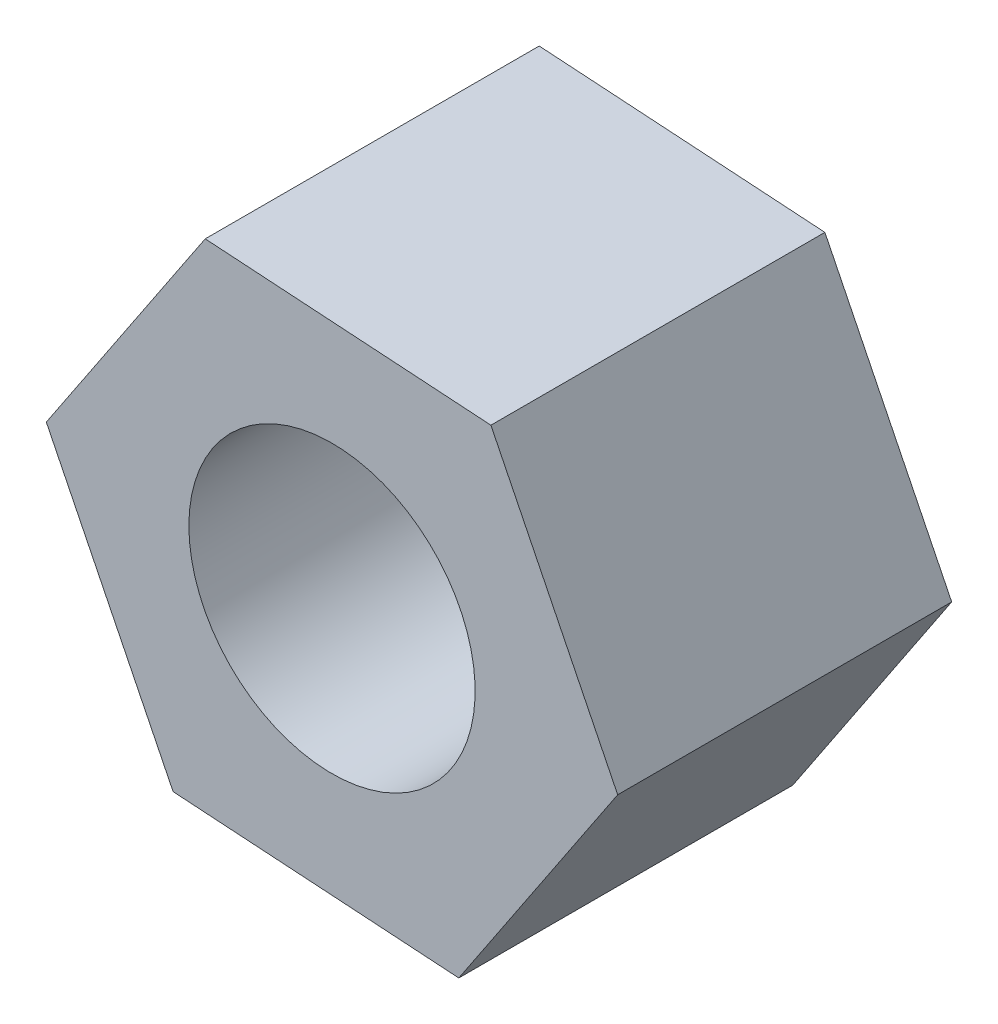
ISO-10303-21;
HEADER;
FILE_DESCRIPTION(('STEP AP214'),'2;1');
FILE_NAME('part.step','',(''),(''),'','','');
FILE_SCHEMA(('AUTOMOTIVE_DESIGN { 1 0 10303 214 1 1 1 1 }'));
ENDSEC;
DATA;
#1=APPLICATION_CONTEXT('core data for automotive mechanical design processes');
#2=APPLICATION_PROTOCOL_DEFINITION('international standard','automotive_design',2000,#1);
#3=PRODUCT_CONTEXT('',#1,'mechanical');
#4=PRODUCT('Part','Part','',(#3));
#5=PRODUCT_RELATED_PRODUCT_CATEGORY('part','',(#4));
#6=PRODUCT_DEFINITION_FORMATION('','',#4);
#7=PRODUCT_DEFINITION_CONTEXT('part definition',#1,'design');
#8=PRODUCT_DEFINITION('design','',#6,#7);
#9=PRODUCT_DEFINITION_SHAPE('','',#8);
#10=(LENGTH_UNIT() NAMED_UNIT(*) SI_UNIT(.MILLI.,.METRE.));
#11=(NAMED_UNIT(*) PLANE_ANGLE_UNIT() SI_UNIT($,.RADIAN.));
#12=(NAMED_UNIT(*) SI_UNIT($,.STERADIAN.) SOLID_ANGLE_UNIT());
#13=UNCERTAINTY_MEASURE_WITH_UNIT(LENGTH_MEASURE(1.E-05),#10,'distance_accuracy_value','');
#14=(GEOMETRIC_REPRESENTATION_CONTEXT(3) GLOBAL_UNCERTAINTY_ASSIGNED_CONTEXT((#13)) GLOBAL_UNIT_ASSIGNED_CONTEXT((#10,
#11,#12)) REPRESENTATION_CONTEXT('',''));
#15=CARTESIAN_POINT('',(0.,0.,0.));
#16=DIRECTION('',(0.,0.,1.));
#17=DIRECTION('',(1.,0.,0.));
#18=AXIS2_PLACEMENT_3D('',#15,#16,#17);
#19=CARTESIAN_POINT('',(-1.11022302462516E-13,1.66533453693773E-13,70.0000000000001));
#20=DIRECTION('',(0.,0.,0.999999999999999));
#21=DIRECTION('',(1.,0.,0.));
#22=AXIS2_PLACEMENT_3D('',#19,#20,#21);
#23=PLANE('',#22);
#24=DIRECTION('',(-0.555047324024189,-0.831818771183719,0.));
#25=VECTOR('',#24,1.);
#26=CARTESIAN_POINT('',(-26.5711515106658,53.7956681099628,69.9999999999995));
#27=LINE('',#26,#25);
#28=CARTESIAN_POINT('',(-26.5711515106658,53.7956681099628,69.9999999999995));
#29=VERTEX_POINT('',#28);
#30=CARTESIAN_POINT('',(-59.8739909521171,3.88654183893933,70.0000000000001));
#31=VERTEX_POINT('',#30);
#32=EDGE_CURVE('E152',#29,#31,#27,.T.);
#33=ORIENTED_EDGE('',*,*,#32,.T.);
#34=DIRECTION('',(0.442852525177762,-0.89659446849938,0.));
#35=VECTOR('',#34,1.);
#36=CARTESIAN_POINT('',(-59.8739909521171,3.88654183893933,70.0000000000001));
#37=LINE('',#36,#35);
#38=CARTESIAN_POINT('',(-33.3028394414516,-49.9091262710231,70.0000000000001));
#39=VERTEX_POINT('',#38);
#40=EDGE_CURVE('E99',#31,#39,#37,.T.);
#41=ORIENTED_EDGE('',*,*,#40,.T.);
#42=DIRECTION('',(0.997899849201951,-0.0647756973156602,0.));
#43=VECTOR('',#42,1.);
#44=CARTESIAN_POINT('',(-33.3028394414516,-49.9091262710231,70.0000000000001));
#45=LINE('',#44,#43);
#46=CARTESIAN_POINT('',(26.5711515106654,-53.7956681099627,70.0000000000001));
#47=VERTEX_POINT('',#46);
#48=EDGE_CURVE('E112',#39,#47,#45,.T.);
#49=ORIENTED_EDGE('',*,*,#48,.T.);
#50=DIRECTION('',(0.555047324024189,0.831818771183719,0.));
#51=VECTOR('',#50,1.);
#52=CARTESIAN_POINT('',(26.5711515106654,-53.7956681099627,70.0000000000001));
#53=LINE('',#52,#51);
#54=CARTESIAN_POINT('',(59.8739909521168,-3.88654183893977,69.9999999999995));
#55=VERTEX_POINT('',#54);
#56=EDGE_CURVE('E106',#47,#55,#53,.T.);
#57=ORIENTED_EDGE('',*,*,#56,.T.);
#58=DIRECTION('',(-0.442852525177762,0.896594468499379,0.));
#59=VECTOR('',#58,1.);
#60=CARTESIAN_POINT('',(59.8739909521168,-3.88654183893977,69.9999999999995));
#61=LINE('',#60,#59);
#62=CARTESIAN_POINT('',(33.3028394414508,49.9091262710232,70.0000000000001));
#63=VERTEX_POINT('',#62);
#64=EDGE_CURVE('E110',#55,#63,#61,.T.);
#65=ORIENTED_EDGE('',*,*,#64,.T.);
#66=DIRECTION('',(-0.997899849201951,0.0647756973156602,0.));
#67=VECTOR('',#66,1.);
#68=CARTESIAN_POINT('',(33.3028394414508,49.9091262710232,70.0000000000001));
#69=LINE('',#68,#67);
#70=EDGE_CURVE('E62',#63,#29,#69,.T.);
#71=ORIENTED_EDGE('',*,*,#70,.T.);
#72=EDGE_LOOP('',(#33,#41,#49,#57,#65,#71));
#73=FACE_BOUND('',#72,.T.);
#74=CARTESIAN_POINT('',(-1.11022302462516E-13,1.66533453693773E-13,70.0000000000001));
#75=DIRECTION('',(0.,0.,0.999999999999999));
#76=DIRECTION('',(1.,0.,0.));
#77=AXIS2_PLACEMENT_3D('',#74,#75,#76);
#78=CIRCLE('',#77,30.);
#79=CARTESIAN_POINT('',(-30.0000000000002,1.64868119156836E-13,70.0000000000001));
#80=VERTEX_POINT('',#79);
#81=EDGE_CURVE('E140',#80,#80,#78,.T.);
#82=ORIENTED_EDGE('',*,*,#81,.F.);
#83=EDGE_LOOP('',(#82));
#84=FACE_BOUND('',#83,.T.);
#85=ADVANCED_FACE('F44',(#73,#84),#23,.T.);
#86=CARTESIAN_POINT('',(0.,0.,0.));
#87=DIRECTION('',(0.,0.,0.999999999999999));
#88=DIRECTION('',(1.,0.,0.));
#89=AXIS2_PLACEMENT_3D('',#86,#87,#88);
#90=PLANE('',#89);
#91=DIRECTION('',(-0.555047324024189,-0.831818771183719,0.));
#92=VECTOR('',#91,1.);
#93=CARTESIAN_POINT('',(-26.5711515106657,53.7956681099627,0.));
#94=LINE('',#93,#92);
#95=CARTESIAN_POINT('',(-26.5711515106657,53.7956681099627,0.));
#96=VERTEX_POINT('',#95);
#97=CARTESIAN_POINT('',(-59.8739909521172,3.88654183893944,0.));
#98=VERTEX_POINT('',#97);
#99=EDGE_CURVE('E135',#96,#98,#94,.T.);
#100=ORIENTED_EDGE('',*,*,#99,.F.);
#101=DIRECTION('',(-0.997899849201951,0.0647756973156602,0.));
#102=VECTOR('',#101,1.);
#103=CARTESIAN_POINT('',(33.3028394414511,49.9091262710231,-2.22044604925031E-13));
#104=LINE('',#103,#102);
#105=CARTESIAN_POINT('',(33.3028394414511,49.9091262710231,-2.22044604925031E-13));
#106=VERTEX_POINT('',#105);
#107=EDGE_CURVE('E91',#106,#96,#104,.T.);
#108=ORIENTED_EDGE('',*,*,#107,.F.);
#109=DIRECTION('',(-0.442852525177762,0.896594468499379,0.));
#110=VECTOR('',#109,1.);
#111=CARTESIAN_POINT('',(59.8739909521168,-3.88654183893994,-2.22044604925031E-13));
#112=LINE('',#111,#110);
#113=CARTESIAN_POINT('',(59.8739909521168,-3.88654183893994,-2.22044604925031E-13));
#114=VERTEX_POINT('',#113);
#115=EDGE_CURVE('E85',#114,#106,#112,.T.);
#116=ORIENTED_EDGE('',*,*,#115,.F.);
#117=DIRECTION('',(0.555047324024189,0.831818771183719,0.));
#118=VECTOR('',#117,1.);
#119=CARTESIAN_POINT('',(26.5711515106654,-53.7956681099627,0.));
#120=LINE('',#119,#118);
#121=CARTESIAN_POINT('',(26.5711515106654,-53.7956681099627,0.));
#122=VERTEX_POINT('',#121);
#123=EDGE_CURVE('E121',#122,#114,#120,.T.);
#124=ORIENTED_EDGE('',*,*,#123,.F.);
#125=DIRECTION('',(0.997899849201951,-0.0647756973156602,0.));
#126=VECTOR('',#125,1.);
#127=CARTESIAN_POINT('',(-33.3028394414516,-49.9091262710233,0.));
#128=LINE('',#127,#126);
#129=CARTESIAN_POINT('',(-33.3028394414516,-49.9091262710233,0.));
#130=VERTEX_POINT('',#129);
#131=EDGE_CURVE('E143',#130,#122,#128,.T.);
#132=ORIENTED_EDGE('',*,*,#131,.F.);
#133=DIRECTION('',(0.442852525177762,-0.89659446849938,0.));
#134=VECTOR('',#133,1.);
#135=CARTESIAN_POINT('',(-59.8739909521172,3.88654183893944,0.));
#136=LINE('',#135,#134);
#137=EDGE_CURVE('E139',#98,#130,#136,.T.);
#138=ORIENTED_EDGE('',*,*,#137,.F.);
#139=EDGE_LOOP('',(#100,#108,#116,#124,#132,#138));
#140=FACE_BOUND('',#139,.T.);
#141=CARTESIAN_POINT('',(0.,0.,0.));
#142=DIRECTION('',(0.,0.,0.999999999999999));
#143=DIRECTION('',(1.,0.,0.));
#144=AXIS2_PLACEMENT_3D('',#141,#142,#143);
#145=CIRCLE('',#144,30.);
#146=CARTESIAN_POINT('',(-30.0000000000002,1.58099769733961E-13,0.));
#147=VERTEX_POINT('',#146);
#148=EDGE_CURVE('E273',#147,#147,#145,.T.);
#149=ORIENTED_EDGE('',*,*,#148,.T.);
#150=EDGE_LOOP('',(#149));
#151=FACE_BOUND('',#150,.T.);
#152=ADVANCED_FACE('F166',(#140,#151),#90,.F.);
#153=CARTESIAN_POINT('',(-26.5711515106658,53.7956681099628,69.9999999999995));
#154=DIRECTION('',(0.83181877118372,-0.555047324024189,0.));
#155=DIRECTION('',(0.555047324024189,0.831818771183719,0.));
#156=AXIS2_PLACEMENT_3D('',#153,#154,#155);
#157=PLANE('',#156);
#158=ORIENTED_EDGE('',*,*,#99,.T.);
#159=DIRECTION('',(0.,0.,-0.999999999999999));
#160=VECTOR('',#159,1.);
#161=CARTESIAN_POINT('',(-59.8739909521171,3.88654183893933,70.0000000000001));
#162=LINE('',#161,#160);
#163=EDGE_CURVE('E11',#31,#98,#162,.T.);
#164=ORIENTED_EDGE('',*,*,#163,.F.);
#165=ORIENTED_EDGE('',*,*,#32,.F.);
#166=DIRECTION('',(0.,0.,-0.999999999999999));
#167=VECTOR('',#166,1.);
#168=CARTESIAN_POINT('',(-26.5711515106658,53.7956681099628,69.9999999999995));
#169=LINE('',#168,#167);
#170=EDGE_CURVE('E131',#29,#96,#169,.T.);
#171=ORIENTED_EDGE('',*,*,#170,.T.);
#172=EDGE_LOOP('',(#158,#164,#165,#171));
#173=FACE_BOUND('',#172,.T.);
#174=ADVANCED_FACE('F46',(#173),#157,.F.);
#175=CARTESIAN_POINT('',(-59.8739909521171,3.88654183893933,70.0000000000001));
#176=DIRECTION('',(0.89659446849938,0.442852525177762,0.));
#177=DIRECTION('',(-0.442852525177762,0.89659446849938,0.));
#178=AXIS2_PLACEMENT_3D('',#175,#176,#177);
#179=PLANE('',#178);
#180=ORIENTED_EDGE('',*,*,#137,.T.);
#181=DIRECTION('',(0.,0.,-0.999999999999999));
#182=VECTOR('',#181,1.);
#183=CARTESIAN_POINT('',(-33.3028394414516,-49.9091262710231,70.0000000000001));
#184=LINE('',#183,#182);
#185=EDGE_CURVE('E54',#39,#130,#184,.T.);
#186=ORIENTED_EDGE('',*,*,#185,.F.);
#187=ORIENTED_EDGE('',*,*,#40,.F.);
#188=ORIENTED_EDGE('',*,*,#163,.T.);
#189=EDGE_LOOP('',(#180,#186,#187,#188));
#190=FACE_BOUND('',#189,.T.);
#191=ADVANCED_FACE('F191',(#190),#179,.F.);
#192=CARTESIAN_POINT('',(-33.3028394414516,-49.9091262710231,70.0000000000001));
#193=DIRECTION('',(0.0647756973156609,0.99789984920195,0.));
#194=DIRECTION('',(-0.997899849201951,0.0647756973156602,0.));
#195=AXIS2_PLACEMENT_3D('',#192,#193,#194);
#196=PLANE('',#195);
#197=ORIENTED_EDGE('',*,*,#131,.T.);
#198=DIRECTION('',(0.,0.,-0.999999999999999));
#199=VECTOR('',#198,1.);
#200=CARTESIAN_POINT('',(26.5711515106654,-53.7956681099627,70.0000000000001));
#201=LINE('',#200,#199);
#202=EDGE_CURVE('E123',#47,#122,#201,.T.);
#203=ORIENTED_EDGE('',*,*,#202,.F.);
#204=ORIENTED_EDGE('',*,*,#48,.F.);
#205=ORIENTED_EDGE('',*,*,#185,.T.);
#206=EDGE_LOOP('',(#197,#203,#204,#205));
#207=FACE_BOUND('',#206,.T.);
#208=ADVANCED_FACE('F163',(#207),#196,.F.);
#209=CARTESIAN_POINT('',(26.5711515106654,-53.7956681099627,70.0000000000001));
#210=DIRECTION('',(-0.83181877118372,0.555047324024189,0.));
#211=DIRECTION('',(-0.555047324024189,-0.831818771183719,0.));
#212=AXIS2_PLACEMENT_3D('',#209,#210,#211);
#213=PLANE('',#212);
#214=ORIENTED_EDGE('',*,*,#123,.T.);
#215=DIRECTION('',(0.,0.,-0.999999999999999));
#216=VECTOR('',#215,1.);
#217=CARTESIAN_POINT('',(59.8739909521168,-3.88654183893977,69.9999999999995));
#218=LINE('',#217,#216);
#219=EDGE_CURVE('E118',#55,#114,#218,.T.);
#220=ORIENTED_EDGE('',*,*,#219,.F.);
#221=ORIENTED_EDGE('',*,*,#56,.F.);
#222=ORIENTED_EDGE('',*,*,#202,.T.);
#223=EDGE_LOOP('',(#214,#220,#221,#222));
#224=FACE_BOUND('',#223,.T.);
#225=ADVANCED_FACE('F119',(#224),#213,.F.);
#226=CARTESIAN_POINT('',(59.8739909521168,-3.88654183893977,69.9999999999995));
#227=DIRECTION('',(-0.89659446849938,-0.442852525177762,0.));
#228=DIRECTION('',(0.442852525177762,-0.896594468499379,0.));
#229=AXIS2_PLACEMENT_3D('',#226,#227,#228);
#230=PLANE('',#229);
#231=ORIENTED_EDGE('',*,*,#115,.T.);
#232=DIRECTION('',(0.,0.,-0.999999999999999));
#233=VECTOR('',#232,1.);
#234=CARTESIAN_POINT('',(33.3028394414508,49.9091262710232,70.0000000000001));
#235=LINE('',#234,#233);
#236=EDGE_CURVE('E124',#63,#106,#235,.T.);
#237=ORIENTED_EDGE('',*,*,#236,.F.);
#238=ORIENTED_EDGE('',*,*,#64,.F.);
#239=ORIENTED_EDGE('',*,*,#219,.T.);
#240=EDGE_LOOP('',(#231,#237,#238,#239));
#241=FACE_BOUND('',#240,.T.);
#242=ADVANCED_FACE('F126',(#241),#230,.F.);
#243=CARTESIAN_POINT('',(33.3028394414508,49.9091262710232,70.0000000000001));
#244=DIRECTION('',(-0.0647756973156609,-0.99789984920195,0.));
#245=DIRECTION('',(0.997899849201951,-0.0647756973156602,0.));
#246=AXIS2_PLACEMENT_3D('',#243,#244,#245);
#247=PLANE('',#246);
#248=ORIENTED_EDGE('',*,*,#107,.T.);
#249=ORIENTED_EDGE('',*,*,#170,.F.);
#250=ORIENTED_EDGE('',*,*,#70,.F.);
#251=ORIENTED_EDGE('',*,*,#236,.T.);
#252=EDGE_LOOP('',(#248,#249,#250,#251));
#253=FACE_BOUND('',#252,.T.);
#254=ADVANCED_FACE('F171',(#253),#247,.F.);
#255=CARTESIAN_POINT('',(-1.11022302462516E-13,1.66533453693773E-13,70.0000000000001));
#256=DIRECTION('',(0.,0.,-0.999999999999999));
#257=DIRECTION('',(-1.,0.,0.));
#258=AXIS2_PLACEMENT_3D('',#255,#256,#257);
#259=CYLINDRICAL_SURFACE('',#258,30.);
#260=CARTESIAN_POINT('',(-30.0000000000002,1.64868119156836E-13,70.0000000000001));
#261=CARTESIAN_POINT('',(-30.0000000000002,1.64797615517014E-13,69.2708333333334));
#262=CARTESIAN_POINT('',(-30.0000000000002,1.64727111877193E-13,68.5416666666667));
#263=CARTESIAN_POINT('',(-30.0000000000002,1.64586104597549E-13,67.0833333333334));
#264=CARTESIAN_POINT('',(-30.0000000000002,1.64515600957728E-13,66.3541666666667));
#265=CARTESIAN_POINT('',(-30.0000000000002,1.64374593678085E-13,64.8958333333334));
#266=CARTESIAN_POINT('',(-30.0000000000002,1.64304090038263E-13,64.1666666666667));
#267=CARTESIAN_POINT('',(-30.0000000000002,1.6416308275862E-13,62.7083333333334));
#268=CARTESIAN_POINT('',(-30.0000000000002,1.64092579118798E-13,61.9791666666667));
#269=CARTESIAN_POINT('',(-30.0000000000002,1.63951571839155E-13,60.5208333333334));
#270=CARTESIAN_POINT('',(-30.0000000000002,1.63881068199333E-13,59.7916666666667));
#271=CARTESIAN_POINT('',(-30.0000000000002,1.6374006091969E-13,58.3333333333334));
#272=CARTESIAN_POINT('',(-30.0000000000002,1.63669557279868E-13,57.6041666666667));
#273=CARTESIAN_POINT('',(-30.0000000000002,1.63528550000225E-13,56.1458333333334));
#274=CARTESIAN_POINT('',(-30.0000000000002,1.63458046360404E-13,55.4166666666667));
#275=CARTESIAN_POINT('',(-30.0000000000002,1.6331703908076E-13,53.9583333333334));
#276=CARTESIAN_POINT('',(-30.0000000000002,1.63246535440939E-13,53.2291666666667));
#277=CARTESIAN_POINT('',(-30.0000000000002,1.63105528161296E-13,51.7708333333334));
#278=CARTESIAN_POINT('',(-30.0000000000002,1.63035024521474E-13,51.0416666666667));
#279=CARTESIAN_POINT('',(-30.0000000000002,1.62894017241831E-13,49.5833333333334));
#280=CARTESIAN_POINT('',(-30.0000000000002,1.62823513602009E-13,48.8541666666667));
#281=CARTESIAN_POINT('',(-30.0000000000002,1.62682506322366E-13,47.3958333333334));
#282=CARTESIAN_POINT('',(-30.0000000000002,1.62612002682544E-13,46.6666666666667));
#283=CARTESIAN_POINT('',(-30.0000000000002,1.62470995402901E-13,45.2083333333334));
#284=CARTESIAN_POINT('',(-30.0000000000002,1.62400491763079E-13,44.4791666666667));
#285=CARTESIAN_POINT('',(-30.0000000000002,1.62259484483436E-13,43.0208333333334));
#286=CARTESIAN_POINT('',(-30.0000000000002,1.62188980843615E-13,42.2916666666667));
#287=CARTESIAN_POINT('',(-30.0000000000002,1.62047973563971E-13,40.8333333333334));
#288=CARTESIAN_POINT('',(-30.0000000000002,1.6197746992415E-13,40.1041666666667));
#289=CARTESIAN_POINT('',(-30.0000000000002,1.61836462644507E-13,38.6458333333334));
#290=CARTESIAN_POINT('',(-30.0000000000002,1.61765959004685E-13,37.9166666666667));
#291=CARTESIAN_POINT('',(-30.0000000000002,1.61624951725042E-13,36.4583333333334));
#292=CARTESIAN_POINT('',(-30.0000000000002,1.6155444808522E-13,35.7291666666667));
#293=CARTESIAN_POINT('',(-30.0000000000002,1.61413440805577E-13,34.2708333333334));
#294=CARTESIAN_POINT('',(-30.0000000000002,1.61342937165755E-13,33.5416666666667));
#295=CARTESIAN_POINT('',(-30.0000000000002,1.61201929886112E-13,32.0833333333333));
#296=CARTESIAN_POINT('',(-30.0000000000002,1.61131426246291E-13,31.3541666666667));
#297=CARTESIAN_POINT('',(-30.0000000000002,1.60990418966647E-13,29.8958333333333));
#298=CARTESIAN_POINT('',(-30.0000000000002,1.60919915326826E-13,29.1666666666667));
#299=CARTESIAN_POINT('',(-30.0000000000002,1.60778908047183E-13,27.7083333333333));
#300=CARTESIAN_POINT('',(-30.0000000000002,1.60708404407361E-13,26.9791666666667));
#301=CARTESIAN_POINT('',(-30.0000000000002,1.60567397127718E-13,25.5208333333333));
#302=CARTESIAN_POINT('',(-30.0000000000002,1.60496893487896E-13,24.7916666666667));
#303=CARTESIAN_POINT('',(-30.0000000000002,1.60355886208253E-13,23.3333333333333));
#304=CARTESIAN_POINT('',(-30.0000000000002,1.60285382568431E-13,22.6041666666667));
#305=CARTESIAN_POINT('',(-30.0000000000002,1.60144375288788E-13,21.1458333333333));
#306=CARTESIAN_POINT('',(-30.0000000000002,1.60073871648966E-13,20.4166666666667));
#307=CARTESIAN_POINT('',(-30.0000000000002,1.59932864369323E-13,18.9583333333333));
#308=CARTESIAN_POINT('',(-30.0000000000002,1.59862360729502E-13,18.2291666666667));
#309=CARTESIAN_POINT('',(-30.0000000000002,1.59721353449858E-13,16.7708333333333));
#310=CARTESIAN_POINT('',(-30.0000000000002,1.59650849810037E-13,16.0416666666667));
#311=CARTESIAN_POINT('',(-30.0000000000002,1.59509842530394E-13,14.5833333333333));
#312=CARTESIAN_POINT('',(-30.0000000000002,1.59439338890572E-13,13.8541666666667));
#313=CARTESIAN_POINT('',(-30.0000000000002,1.59298331610929E-13,12.3958333333333));
#314=CARTESIAN_POINT('',(-30.0000000000002,1.59227827971107E-13,11.6666666666667));
#315=CARTESIAN_POINT('',(-30.0000000000002,1.59086820691464E-13,10.2083333333333));
#316=CARTESIAN_POINT('',(-30.0000000000002,1.59016317051642E-13,9.47916666666667));
#317=CARTESIAN_POINT('',(-30.0000000000002,1.58875309771999E-13,8.02083333333334));
#318=CARTESIAN_POINT('',(-30.0000000000002,1.58804806132178E-13,7.29166666666668));
#319=CARTESIAN_POINT('',(-30.0000000000002,1.58663798852534E-13,5.83333333333334));
#320=CARTESIAN_POINT('',(-30.0000000000002,1.58593295212713E-13,5.10416666666667));
#321=CARTESIAN_POINT('',(-30.0000000000002,1.58452287933069E-13,3.64583333333334));
#322=CARTESIAN_POINT('',(-30.0000000000002,1.58381784293248E-13,2.91666666666667));
#323=CARTESIAN_POINT('',(-30.0000000000002,1.58240777013605E-13,1.45833333333334));
#324=CARTESIAN_POINT('',(-30.0000000000002,1.58170273373783E-13,0.729166666666667));
#325=CARTESIAN_POINT('',(-30.0000000000002,1.58099769733961E-13,0.));
#326=B_SPLINE_CURVE_WITH_KNOTS('',3,(#260,#261,#262,#263,#264,#265,#266,#267,#268,#269,#270,
#271,#272,#273,#274,#275,#276,#277,#278,#279,#280,#281,#282,#283,#284,#285,#286,#287,#288,#289,
#290,#291,#292,#293,#294,#295,#296,#297,#298,#299,#300,#301,#302,#303,#304,#305,#306,#307,#308,
#309,#310,#311,#312,#313,#314,#315,#316,#317,#318,#319,#320,#321,#322,#323,#324,#325),
.UNSPECIFIED.,.F.,.F.,(4,2,2,2,2,2,2,2,2,2,2,2,2,2,2,2,2,2,2,2,2,2,2,2,2,2,2,2,2,2,2,2,4),(0.,
2.18750000000001,4.37500000000002,6.56250000000001,8.75000000000001,10.9375,13.125,15.3125,17.5,
19.6875,21.875,24.0625,26.25,28.4375,30.625,32.8125,35.,37.1875,39.375,41.5625,43.75,45.9375,
48.125,50.3125,52.5000000000001,54.6875000000001,56.8750000000001,59.0625000000001,
61.2500000000001,63.4375,65.6250000000001,67.8125000000001,70.0000000000001),.UNSPECIFIED.);
#327=EDGE_CURVE('BSEAM173',#80,#147,#326,.T.);
#328=ORIENTED_EDGE('',*,*,#81,.T.);
#329=ORIENTED_EDGE('',*,*,#148,.F.);
#330=ORIENTED_EDGE('',*,*,#327,.T.);
#331=ORIENTED_EDGE('',*,*,#327,.F.);
#332=EDGE_LOOP('',(#328,#330,#329,#331));
#333=FACE_BOUND('',#332,.T.);
#334=ADVANCED_FACE('F173',(#333),#259,.F.);
#335=CLOSED_SHELL('',(#85,#152,#174,#191,#208,#225,#242,#254,#334));
#336=MANIFOLD_SOLID_BREP('B2',#335);
#337=ADVANCED_BREP_SHAPE_REPRESENTATION('',(#18,#336),#14);
#338=SHAPE_DEFINITION_REPRESENTATION(#9,#337);
ENDSEC;
END-ISO-10303-21;
